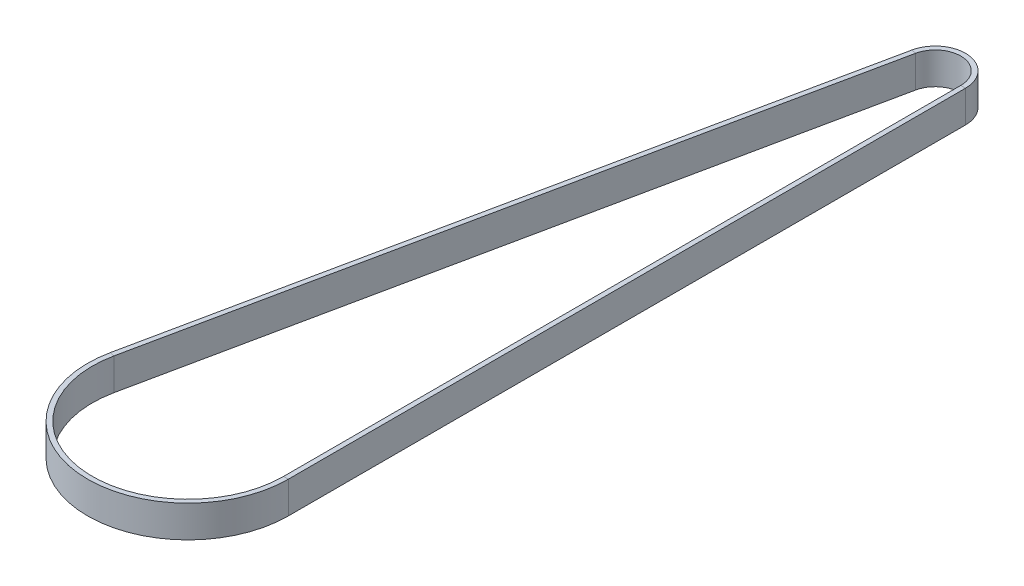
ISO-10303-21;
HEADER;
FILE_DESCRIPTION(('STEP AP214'),'2;1');
FILE_NAME('part.step','',(''),(''),'','','');
FILE_SCHEMA(('AUTOMOTIVE_DESIGN { 1 0 10303 214 1 1 1 1 }'));
ENDSEC;
DATA;
#1=APPLICATION_CONTEXT('core data for automotive mechanical design processes');
#2=APPLICATION_PROTOCOL_DEFINITION('international standard','automotive_design',2000,#1);
#3=PRODUCT_CONTEXT('',#1,'mechanical');
#4=PRODUCT('Part','Part','',(#3));
#5=PRODUCT_RELATED_PRODUCT_CATEGORY('part','',(#4));
#6=PRODUCT_DEFINITION_FORMATION('','',#4);
#7=PRODUCT_DEFINITION_CONTEXT('part definition',#1,'design');
#8=PRODUCT_DEFINITION('design','',#6,#7);
#9=PRODUCT_DEFINITION_SHAPE('','',#8);
#10=(LENGTH_UNIT() NAMED_UNIT(*) SI_UNIT(.MILLI.,.METRE.));
#11=(NAMED_UNIT(*) PLANE_ANGLE_UNIT() SI_UNIT($,.RADIAN.));
#12=(NAMED_UNIT(*) SI_UNIT($,.STERADIAN.) SOLID_ANGLE_UNIT());
#13=UNCERTAINTY_MEASURE_WITH_UNIT(LENGTH_MEASURE(1.E-05),#10,'distance_accuracy_value','');
#14=(GEOMETRIC_REPRESENTATION_CONTEXT(3) GLOBAL_UNCERTAINTY_ASSIGNED_CONTEXT((#13)) GLOBAL_UNIT_ASSIGNED_CONTEXT((#10,
#11,#12)) REPRESENTATION_CONTEXT('',''));
#15=CARTESIAN_POINT('',(0.,0.,0.));
#16=DIRECTION('',(0.,0.,1.));
#17=DIRECTION('',(1.,0.,0.));
#18=AXIS2_PLACEMENT_3D('',#15,#16,#17);
#19=CARTESIAN_POINT('',(-7.83032520636938,0.,-1.63890425665942));
#20=DIRECTION('',(0.,-1.,0.));
#21=DIRECTION('',(0.,0.,-1.));
#22=AXIS2_PLACEMENT_3D('',#19,#20,#21);
#23=PLANE('',#22);
#24=CARTESIAN_POINT('',(0.,0.,0.));
#25=DIRECTION('',(0.,-1.,0.));
#26=DIRECTION('',(-0.978790650796172,0.,-0.204863032082428));
#27=AXIS2_PLACEMENT_3D('',#24,#25,#26);
#28=CIRCLE('',#27,8.);
#29=CARTESIAN_POINT('',(-7.83032520636939,0.,-1.63890425665938));
#30=VERTEX_POINT('',#29);
#31=CARTESIAN_POINT('',(8.,0.,0.));
#32=VERTEX_POINT('',#31);
#33=EDGE_CURVE('E11',#30,#32,#28,.T.);
#34=ORIENTED_EDGE('',*,*,#33,.F.);
#35=DIRECTION('',(-0.978790650796172,0.,-0.204863032082427));
#36=VECTOR('',#35,1.);
#37=CARTESIAN_POINT('',(-7.83032520636938,0.,-1.63890425665942));
#38=LINE('',#37,#36);
#39=CARTESIAN_POINT('',(-9.29851118256365,0.,-1.94619880478303));
#40=VERTEX_POINT('',#39);
#41=EDGE_CURVE('E46',#30,#40,#38,.T.);
#42=ORIENTED_EDGE('',*,*,#41,.T.);
#43=CARTESIAN_POINT('',(0.,0.,0.));
#44=DIRECTION('',(0.,-1.,0.));
#45=DIRECTION('',(-0.978790650796172,0.,-0.204863032082428));
#46=AXIS2_PLACEMENT_3D('',#43,#44,#45);
#47=CIRCLE('',#46,9.5);
#48=CARTESIAN_POINT('',(9.5,0.,0.));
#49=VERTEX_POINT('',#48);
#50=EDGE_CURVE('E123',#40,#49,#47,.T.);
#51=ORIENTED_EDGE('',*,*,#50,.T.);
#52=DIRECTION('',(1.,0.,0.));
#53=VECTOR('',#52,1.);
#54=CARTESIAN_POINT('',(8.,0.,0.));
#55=LINE('',#54,#53);
#56=EDGE_CURVE('E126',#32,#49,#55,.T.);
#57=ORIENTED_EDGE('',*,*,#56,.F.);
#58=EDGE_LOOP('',(#34,#42,#51,#57));
#59=FACE_BOUND('',#58,.T.);
#60=ADVANCED_FACE('F43',(#59),#23,.T.);
#61=CARTESIAN_POINT('',(0.,0.,0.));
#62=DIRECTION('',(0.,-1.,0.));
#63=DIRECTION('',(0.,0.,-1.));
#64=AXIS2_PLACEMENT_3D('',#61,#62,#63);
#65=CYLINDRICAL_SURFACE('',#64,8.);
#66=CARTESIAN_POINT('',(0.,10.,0.));
#67=DIRECTION('',(0.,-1.,0.));
#68=DIRECTION('',(-0.978790650796172,0.,-0.204863032082428));
#69=AXIS2_PLACEMENT_3D('',#66,#67,#68);
#70=CIRCLE('',#69,8.);
#71=CARTESIAN_POINT('',(-7.83032520636939,10.,-1.63890425665938));
#72=VERTEX_POINT('',#71);
#73=CARTESIAN_POINT('',(8.,10.,0.));
#74=VERTEX_POINT('',#73);
#75=EDGE_CURVE('E52',#72,#74,#70,.T.);
#76=ORIENTED_EDGE('',*,*,#75,.F.);
#77=DIRECTION('',(0.,-1.,0.));
#78=VECTOR('',#77,1.);
#79=CARTESIAN_POINT('',(-7.83032520636938,0.,-1.63890425665942));
#80=LINE('',#79,#78);
#81=EDGE_CURVE('E216',#72,#30,#80,.T.);
#82=ORIENTED_EDGE('',*,*,#81,.T.);
#83=ORIENTED_EDGE('',*,*,#33,.T.);
#84=DIRECTION('',(0.,-1.,0.));
#85=VECTOR('',#84,1.);
#86=CARTESIAN_POINT('',(8.,0.,0.));
#87=LINE('',#86,#85);
#88=EDGE_CURVE('E153',#74,#32,#87,.T.);
#89=ORIENTED_EDGE('',*,*,#88,.F.);
#90=EDGE_LOOP('',(#76,#82,#83,#89));
#91=FACE_BOUND('',#90,.T.);
#92=ADVANCED_FACE('F265',(#91),#65,.F.);
#93=CARTESIAN_POINT('',(-7.83032520636938,10.,-1.63890425665942));
#94=DIRECTION('',(0.,1.,0.));
#95=DIRECTION('',(0.,0.,1.));
#96=AXIS2_PLACEMENT_3D('',#93,#94,#95);
#97=PLANE('',#96);
#98=CARTESIAN_POINT('',(0.,10.,0.));
#99=DIRECTION('',(0.,-1.,0.));
#100=DIRECTION('',(-0.978790650796172,0.,-0.204863032082428));
#101=AXIS2_PLACEMENT_3D('',#98,#99,#100);
#102=CIRCLE('',#101,9.5);
#103=CARTESIAN_POINT('',(-9.29851118256365,10.,-1.94619880478303));
#104=VERTEX_POINT('',#103);
#105=CARTESIAN_POINT('',(9.5,10.,0.));
#106=VERTEX_POINT('',#105);
#107=EDGE_CURVE('E133',#104,#106,#102,.T.);
#108=ORIENTED_EDGE('',*,*,#107,.F.);
#109=DIRECTION('',(0.978790650796172,0.,0.204863032082427));
#110=VECTOR('',#109,1.);
#111=CARTESIAN_POINT('',(-7.83032520636938,10.,-1.63890425665942));
#112=LINE('',#111,#110);
#113=EDGE_CURVE('E189',#104,#72,#112,.T.);
#114=ORIENTED_EDGE('',*,*,#113,.T.);
#115=ORIENTED_EDGE('',*,*,#75,.T.);
#116=DIRECTION('',(-1.,0.,0.));
#117=VECTOR('',#116,1.);
#118=CARTESIAN_POINT('',(8.,10.,0.));
#119=LINE('',#118,#117);
#120=EDGE_CURVE('E158',#106,#74,#119,.T.);
#121=ORIENTED_EDGE('',*,*,#120,.F.);
#122=EDGE_LOOP('',(#108,#114,#115,#121));
#123=FACE_BOUND('',#122,.T.);
#124=ADVANCED_FACE('F269',(#123),#97,.T.);
#125=CARTESIAN_POINT('',(-51.3637195238851,0.,206.354109037527));
#126=DIRECTION('',(0.,-1.,0.));
#127=DIRECTION('',(0.,0.,-1.));
#128=AXIS2_PLACEMENT_3D('',#125,#126,#127);
#129=PLANE('',#128);
#130=ORIENTED_EDGE('',*,*,#41,.F.);
#131=DIRECTION('',(0.204863032082427,0.,-0.978790650796172));
#132=VECTOR('',#131,1.);
#133=CARTESIAN_POINT('',(-51.3637195238851,0.,206.354109037527));
#134=LINE('',#133,#132);
#135=CARTESIAN_POINT('',(-51.3637195238851,0.,206.354109037527));
#136=VERTEX_POINT('',#135);
#137=EDGE_CURVE('E232',#136,#30,#134,.T.);
#138=ORIENTED_EDGE('',*,*,#137,.F.);
#139=DIRECTION('',(-0.978790650796172,0.,-0.204863032082427));
#140=VECTOR('',#139,1.);
#141=CARTESIAN_POINT('',(-51.3637195238851,0.,206.354109037527));
#142=LINE('',#141,#140);
#143=CARTESIAN_POINT('',(-52.8319055000794,0.,206.046814489404));
#144=VERTEX_POINT('',#143);
#145=EDGE_CURVE('E193',#136,#144,#142,.T.);
#146=ORIENTED_EDGE('',*,*,#145,.T.);
#147=DIRECTION('',(0.204863032082427,0.,-0.978790650796172));
#148=VECTOR('',#147,1.);
#149=CARTESIAN_POINT('',(-52.8319055000794,0.,206.046814489404));
#150=LINE('',#149,#148);
#151=EDGE_CURVE('E185',#144,#40,#150,.T.);
#152=ORIENTED_EDGE('',*,*,#151,.T.);
#153=EDGE_LOOP('',(#130,#138,#146,#152));
#154=FACE_BOUND('',#153,.T.);
#155=ADVANCED_FACE('F242',(#154),#129,.T.);
#156=CARTESIAN_POINT('',(-51.3637195238851,0.,206.354109037527));
#157=DIRECTION('',(0.978790650796172,0.,0.204863032082427));
#158=DIRECTION('',(0.204863032082427,0.,-0.978790650796172));
#159=AXIS2_PLACEMENT_3D('',#156,#157,#158);
#160=PLANE('',#159);
#161=ORIENTED_EDGE('',*,*,#137,.T.);
#162=ORIENTED_EDGE('',*,*,#81,.F.);
#163=DIRECTION('',(0.204863032082427,0.,-0.978790650796172));
#164=VECTOR('',#163,1.);
#165=CARTESIAN_POINT('',(-51.3637195238851,10.,206.354109037527));
#166=LINE('',#165,#164);
#167=CARTESIAN_POINT('',(-51.3637195238851,10.,206.354109037527));
#168=VERTEX_POINT('',#167);
#169=EDGE_CURVE('E212',#168,#72,#166,.T.);
#170=ORIENTED_EDGE('',*,*,#169,.F.);
#171=DIRECTION('',(0.,-1.,0.));
#172=VECTOR('',#171,1.);
#173=CARTESIAN_POINT('',(-51.3637195238851,0.,206.354109037527));
#174=LINE('',#173,#172);
#175=EDGE_CURVE('E206',#168,#136,#174,.T.);
#176=ORIENTED_EDGE('',*,*,#175,.T.);
#177=EDGE_LOOP('',(#161,#162,#170,#176));
#178=FACE_BOUND('',#177,.T.);
#179=ADVANCED_FACE('F278',(#178),#160,.T.);
#180=CARTESIAN_POINT('',(-51.3637195238851,10.,206.354109037527));
#181=DIRECTION('',(0.,1.,0.));
#182=DIRECTION('',(0.,0.,1.));
#183=AXIS2_PLACEMENT_3D('',#180,#181,#182);
#184=PLANE('',#183);
#185=ORIENTED_EDGE('',*,*,#169,.T.);
#186=ORIENTED_EDGE('',*,*,#113,.F.);
#187=DIRECTION('',(0.204863032082427,0.,-0.978790650796172));
#188=VECTOR('',#187,1.);
#189=CARTESIAN_POINT('',(-52.8319055000794,10.,206.046814489404));
#190=LINE('',#189,#188);
#191=CARTESIAN_POINT('',(-52.8319055000794,10.,206.046814489404));
#192=VERTEX_POINT('',#191);
#193=EDGE_CURVE('E184',#192,#104,#190,.T.);
#194=ORIENTED_EDGE('',*,*,#193,.F.);
#195=DIRECTION('',(0.978790650796172,0.,0.204863032082427));
#196=VECTOR('',#195,1.);
#197=CARTESIAN_POINT('',(-51.3637195238851,10.,206.354109037527));
#198=LINE('',#197,#196);
#199=EDGE_CURVE('E174',#192,#168,#198,.T.);
#200=ORIENTED_EDGE('',*,*,#199,.T.);
#201=EDGE_LOOP('',(#185,#186,#194,#200));
#202=FACE_BOUND('',#201,.T.);
#203=ADVANCED_FACE('F250',(#202),#184,.T.);
#204=CARTESIAN_POINT('',(-52.8319055000794,0.,206.046814489404));
#205=DIRECTION('',(-0.978790650796172,0.,-0.204863032082427));
#206=DIRECTION('',(-0.204863032082427,0.,0.978790650796172));
#207=AXIS2_PLACEMENT_3D('',#204,#205,#206);
#208=PLANE('',#207);
#209=ORIENTED_EDGE('',*,*,#193,.T.);
#210=DIRECTION('',(0.,1.,0.));
#211=VECTOR('',#210,1.);
#212=CARTESIAN_POINT('',(-9.29851118256364,0.,-1.94619880478306));
#213=LINE('',#212,#211);
#214=EDGE_CURVE('E181',#40,#104,#213,.T.);
#215=ORIENTED_EDGE('',*,*,#214,.F.);
#216=ORIENTED_EDGE('',*,*,#151,.F.);
#217=DIRECTION('',(0.,1.,0.));
#218=VECTOR('',#217,1.);
#219=CARTESIAN_POINT('',(-52.8319055000794,0.,206.046814489404));
#220=LINE('',#219,#218);
#221=EDGE_CURVE('E170',#144,#192,#220,.T.);
#222=ORIENTED_EDGE('',*,*,#221,.T.);
#223=EDGE_LOOP('',(#209,#215,#216,#222));
#224=FACE_BOUND('',#223,.T.);
#225=ADVANCED_FACE('F247',(#224),#208,.T.);
#226=CARTESIAN_POINT('',(8.00000000000002,0.,212.5));
#227=DIRECTION('',(0.,-1.,0.));
#228=DIRECTION('',(0.,0.,-1.));
#229=AXIS2_PLACEMENT_3D('',#226,#227,#228);
#230=PLANE('',#229);
#231=ORIENTED_EDGE('',*,*,#145,.F.);
#232=CARTESIAN_POINT('',(-22.,0.,212.5));
#233=DIRECTION('',(0.,-1.,0.));
#234=DIRECTION('',(1.,0.,0.));
#235=AXIS2_PLACEMENT_3D('',#232,#233,#234);
#236=CIRCLE('',#235,30.);
#237=CARTESIAN_POINT('',(8.00000000000003,0.,212.5));
#238=VERTEX_POINT('',#237);
#239=EDGE_CURVE('E88',#238,#136,#236,.T.);
#240=ORIENTED_EDGE('',*,*,#239,.F.);
#241=DIRECTION('',(1.,0.,0.));
#242=VECTOR('',#241,1.);
#243=CARTESIAN_POINT('',(8.00000000000003,0.,212.5));
#244=LINE('',#243,#242);
#245=CARTESIAN_POINT('',(9.50000000000003,0.,212.5));
#246=VERTEX_POINT('',#245);
#247=EDGE_CURVE('E180',#238,#246,#244,.T.);
#248=ORIENTED_EDGE('',*,*,#247,.T.);
#249=CARTESIAN_POINT('',(-22.,0.,212.5));
#250=DIRECTION('',(0.,-1.,0.));
#251=DIRECTION('',(1.,0.,0.));
#252=AXIS2_PLACEMENT_3D('',#249,#250,#251);
#253=CIRCLE('',#252,31.5);
#254=EDGE_CURVE('E177',#246,#144,#253,.T.);
#255=ORIENTED_EDGE('',*,*,#254,.T.);
#256=EDGE_LOOP('',(#231,#240,#248,#255));
#257=FACE_BOUND('',#256,.T.);
#258=ADVANCED_FACE('F260',(#257),#230,.T.);
#259=CARTESIAN_POINT('',(-22.,0.,212.5));
#260=DIRECTION('',(0.,-1.,0.));
#261=DIRECTION('',(0.,0.,-1.));
#262=AXIS2_PLACEMENT_3D('',#259,#260,#261);
#263=CYLINDRICAL_SURFACE('',#262,30.);
#264=ORIENTED_EDGE('',*,*,#239,.T.);
#265=ORIENTED_EDGE('',*,*,#175,.F.);
#266=CARTESIAN_POINT('',(-22.,10.,212.5));
#267=DIRECTION('',(0.,-1.,0.));
#268=DIRECTION('',(1.,0.,0.));
#269=AXIS2_PLACEMENT_3D('',#266,#267,#268);
#270=CIRCLE('',#269,30.);
#271=CARTESIAN_POINT('',(8.00000000000003,10.,212.5));
#272=VERTEX_POINT('',#271);
#273=EDGE_CURVE('E98',#272,#168,#270,.T.);
#274=ORIENTED_EDGE('',*,*,#273,.F.);
#275=DIRECTION('',(0.,-1.,0.));
#276=VECTOR('',#275,1.);
#277=CARTESIAN_POINT('',(8.00000000000003,0.,212.5));
#278=LINE('',#277,#276);
#279=EDGE_CURVE('E202',#272,#238,#278,.T.);
#280=ORIENTED_EDGE('',*,*,#279,.T.);
#281=EDGE_LOOP('',(#264,#265,#274,#280));
#282=FACE_BOUND('',#281,.T.);
#283=ADVANCED_FACE('F253',(#282),#263,.F.);
#284=CARTESIAN_POINT('',(8.00000000000002,10.,212.5));
#285=DIRECTION('',(0.,1.,0.));
#286=DIRECTION('',(0.,0.,1.));
#287=AXIS2_PLACEMENT_3D('',#284,#285,#286);
#288=PLANE('',#287);
#289=ORIENTED_EDGE('',*,*,#273,.T.);
#290=ORIENTED_EDGE('',*,*,#199,.F.);
#291=CARTESIAN_POINT('',(-22.,10.,212.5));
#292=DIRECTION('',(0.,-1.,0.));
#293=DIRECTION('',(1.,0.,0.));
#294=AXIS2_PLACEMENT_3D('',#291,#292,#293);
#295=CIRCLE('',#294,31.5);
#296=CARTESIAN_POINT('',(9.50000000000003,10.,212.5));
#297=VERTEX_POINT('',#296);
#298=EDGE_CURVE('E106',#297,#192,#295,.T.);
#299=ORIENTED_EDGE('',*,*,#298,.F.);
#300=DIRECTION('',(-1.,0.,0.));
#301=VECTOR('',#300,1.);
#302=CARTESIAN_POINT('',(8.00000000000003,10.,212.5));
#303=LINE('',#302,#301);
#304=EDGE_CURVE('E168',#297,#272,#303,.T.);
#305=ORIENTED_EDGE('',*,*,#304,.T.);
#306=EDGE_LOOP('',(#289,#290,#299,#305));
#307=FACE_BOUND('',#306,.T.);
#308=ADVANCED_FACE('F251',(#307),#288,.T.);
#309=CARTESIAN_POINT('',(-22.,0.,212.5));
#310=DIRECTION('',(0.,-1.,0.));
#311=DIRECTION('',(0.,0.,-1.));
#312=AXIS2_PLACEMENT_3D('',#309,#310,#311);
#313=CYLINDRICAL_SURFACE('',#312,31.5);
#314=ORIENTED_EDGE('',*,*,#298,.T.);
#315=ORIENTED_EDGE('',*,*,#221,.F.);
#316=ORIENTED_EDGE('',*,*,#254,.F.);
#317=DIRECTION('',(0.,1.,0.));
#318=VECTOR('',#317,1.);
#319=CARTESIAN_POINT('',(9.50000000000003,0.,212.5));
#320=LINE('',#319,#318);
#321=EDGE_CURVE('E143',#246,#297,#320,.T.);
#322=ORIENTED_EDGE('',*,*,#321,.T.);
#323=EDGE_LOOP('',(#314,#315,#316,#322));
#324=FACE_BOUND('',#323,.T.);
#325=ADVANCED_FACE('F245',(#324),#313,.T.);
#326=CARTESIAN_POINT('',(8.,0.,0.));
#327=DIRECTION('',(0.,-1.,0.));
#328=DIRECTION('',(0.,0.,-1.));
#329=AXIS2_PLACEMENT_3D('',#326,#327,#328);
#330=PLANE('',#329);
#331=ORIENTED_EDGE('',*,*,#247,.F.);
#332=DIRECTION('',(0.,0.,1.));
#333=VECTOR('',#332,1.);
#334=CARTESIAN_POINT('',(8.,0.,0.));
#335=LINE('',#334,#333);
#336=EDGE_CURVE('E151',#32,#238,#335,.T.);
#337=ORIENTED_EDGE('',*,*,#336,.F.);
#338=ORIENTED_EDGE('',*,*,#56,.T.);
#339=DIRECTION('',(0.,0.,1.));
#340=VECTOR('',#339,1.);
#341=CARTESIAN_POINT('',(9.5,0.,0.));
#342=LINE('',#341,#340);
#343=EDGE_CURVE('E139',#49,#246,#342,.T.);
#344=ORIENTED_EDGE('',*,*,#343,.T.);
#345=EDGE_LOOP('',(#331,#337,#338,#344));
#346=FACE_BOUND('',#345,.T.);
#347=ADVANCED_FACE('F149',(#346),#330,.T.);
#348=CARTESIAN_POINT('',(8.,0.,0.));
#349=DIRECTION('',(-1.,0.,0.));
#350=DIRECTION('',(0.,0.,1.));
#351=AXIS2_PLACEMENT_3D('',#348,#349,#350);
#352=PLANE('',#351);
#353=ORIENTED_EDGE('',*,*,#336,.T.);
#354=ORIENTED_EDGE('',*,*,#279,.F.);
#355=DIRECTION('',(0.,0.,1.));
#356=VECTOR('',#355,1.);
#357=CARTESIAN_POINT('',(8.,10.,0.));
#358=LINE('',#357,#356);
#359=EDGE_CURVE('E198',#74,#272,#358,.T.);
#360=ORIENTED_EDGE('',*,*,#359,.F.);
#361=ORIENTED_EDGE('',*,*,#88,.T.);
#362=EDGE_LOOP('',(#353,#354,#360,#361));
#363=FACE_BOUND('',#362,.T.);
#364=ADVANCED_FACE('F281',(#363),#352,.T.);
#365=CARTESIAN_POINT('',(8.,10.,0.));
#366=DIRECTION('',(0.,1.,0.));
#367=DIRECTION('',(0.,0.,1.));
#368=AXIS2_PLACEMENT_3D('',#365,#366,#367);
#369=PLANE('',#368);
#370=ORIENTED_EDGE('',*,*,#359,.T.);
#371=ORIENTED_EDGE('',*,*,#304,.F.);
#372=DIRECTION('',(0.,0.,1.));
#373=VECTOR('',#372,1.);
#374=CARTESIAN_POINT('',(9.5,10.,0.));
#375=LINE('',#374,#373);
#376=EDGE_CURVE('E166',#106,#297,#375,.T.);
#377=ORIENTED_EDGE('',*,*,#376,.F.);
#378=ORIENTED_EDGE('',*,*,#120,.T.);
#379=EDGE_LOOP('',(#370,#371,#377,#378));
#380=FACE_BOUND('',#379,.T.);
#381=ADVANCED_FACE('F295',(#380),#369,.T.);
#382=CARTESIAN_POINT('',(9.5,0.,0.));
#383=DIRECTION('',(1.,0.,0.));
#384=DIRECTION('',(0.,0.,-1.));
#385=AXIS2_PLACEMENT_3D('',#382,#383,#384);
#386=PLANE('',#385);
#387=ORIENTED_EDGE('',*,*,#376,.T.);
#388=ORIENTED_EDGE('',*,*,#321,.F.);
#389=ORIENTED_EDGE('',*,*,#343,.F.);
#390=DIRECTION('',(0.,1.,0.));
#391=VECTOR('',#390,1.);
#392=CARTESIAN_POINT('',(9.5,0.,0.));
#393=LINE('',#392,#391);
#394=EDGE_CURVE('E142',#49,#106,#393,.T.);
#395=ORIENTED_EDGE('',*,*,#394,.T.);
#396=EDGE_LOOP('',(#387,#388,#389,#395));
#397=FACE_BOUND('',#396,.T.);
#398=ADVANCED_FACE('F141',(#397),#386,.T.);
#399=CARTESIAN_POINT('',(0.,0.,0.));
#400=DIRECTION('',(0.,-1.,0.));
#401=DIRECTION('',(0.,0.,-1.));
#402=AXIS2_PLACEMENT_3D('',#399,#400,#401);
#403=CYLINDRICAL_SURFACE('',#402,9.5);
#404=ORIENTED_EDGE('',*,*,#214,.T.);
#405=ORIENTED_EDGE('',*,*,#107,.T.);
#406=ORIENTED_EDGE('',*,*,#394,.F.);
#407=ORIENTED_EDGE('',*,*,#50,.F.);
#408=EDGE_LOOP('',(#404,#405,#406,#407));
#409=FACE_BOUND('',#408,.T.);
#410=ADVANCED_FACE('F155',(#409),#403,.T.);
#411=CLOSED_SHELL('',(#60,#92,#124,#155,#179,#203,#225,#258,#283,#308,#325,#347,#364,#381,#398,#410));
#412=MANIFOLD_SOLID_BREP('B2',#411);
#413=ADVANCED_BREP_SHAPE_REPRESENTATION('',(#18,#412),#14);
#414=SHAPE_DEFINITION_REPRESENTATION(#9,#413);
ENDSEC;
END-ISO-10303-21;
